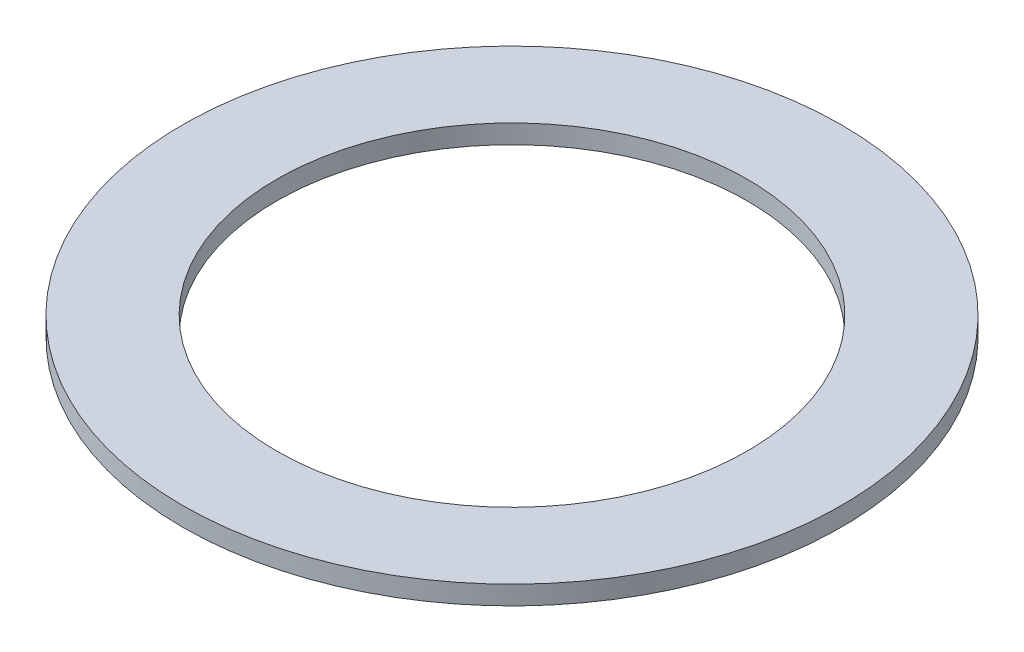
ISO-10303-21;
HEADER;
FILE_DESCRIPTION(('STEP AP214'),'2;1');
FILE_NAME('part.step','',(''),(''),'','','');
FILE_SCHEMA(('AUTOMOTIVE_DESIGN { 1 0 10303 214 1 1 1 1 }'));
ENDSEC;
DATA;
#1=APPLICATION_CONTEXT('core data for automotive mechanical design processes');
#2=APPLICATION_PROTOCOL_DEFINITION('international standard','automotive_design',2000,#1);
#3=PRODUCT_CONTEXT('',#1,'mechanical');
#4=PRODUCT('Part','Part','',(#3));
#5=PRODUCT_RELATED_PRODUCT_CATEGORY('part','',(#4));
#6=PRODUCT_DEFINITION_FORMATION('','',#4);
#7=PRODUCT_DEFINITION_CONTEXT('part definition',#1,'design');
#8=PRODUCT_DEFINITION('design','',#6,#7);
#9=PRODUCT_DEFINITION_SHAPE('','',#8);
#10=(LENGTH_UNIT() NAMED_UNIT(*) SI_UNIT(.MILLI.,.METRE.));
#11=(NAMED_UNIT(*) PLANE_ANGLE_UNIT() SI_UNIT($,.RADIAN.));
#12=(NAMED_UNIT(*) SI_UNIT($,.STERADIAN.) SOLID_ANGLE_UNIT());
#13=UNCERTAINTY_MEASURE_WITH_UNIT(LENGTH_MEASURE(1.E-05),#10,'distance_accuracy_value','');
#14=(GEOMETRIC_REPRESENTATION_CONTEXT(3) GLOBAL_UNCERTAINTY_ASSIGNED_CONTEXT((#13)) GLOBAL_UNIT_ASSIGNED_CONTEXT((#10,
#11,#12)) REPRESENTATION_CONTEXT('',''));
#15=CARTESIAN_POINT('',(0.,0.,0.));
#16=DIRECTION('',(0.,0.,1.));
#17=DIRECTION('',(1.,0.,0.));
#18=AXIS2_PLACEMENT_3D('',#15,#16,#17);
#19=CARTESIAN_POINT('',(0.,0.199999999999978,0.));
#20=DIRECTION('',(0.,-1.,0.));
#21=DIRECTION('',(0.,0.,-1.));
#22=AXIS2_PLACEMENT_3D('',#19,#20,#21);
#23=CYLINDRICAL_SURFACE('',#22,3.5);
#24=CARTESIAN_POINT('',(0.,0.199999999999978,0.));
#25=DIRECTION('',(0.,1.,0.));
#26=DIRECTION('',(0.,0.,1.));
#27=AXIS2_PLACEMENT_3D('',#24,#25,#26);
#28=CIRCLE('',#27,3.5);
#29=CARTESIAN_POINT('',(0.,0.199999999999978,3.50000000000001));
#30=VERTEX_POINT('',#29);
#31=EDGE_CURVE('E10',#30,#30,#28,.T.);
#32=ORIENTED_EDGE('',*,*,#31,.F.);
#33=EDGE_LOOP('',(#32));
#34=FACE_BOUND('',#33,.T.);
#35=CARTESIAN_POINT('',(0.,0.,0.));
#36=DIRECTION('',(0.,1.,0.));
#37=DIRECTION('',(0.,0.,1.));
#38=AXIS2_PLACEMENT_3D('',#35,#36,#37);
#39=CIRCLE('',#38,3.5);
#40=CARTESIAN_POINT('',(0.,0.,3.50000000000001));
#41=VERTEX_POINT('',#40);
#42=EDGE_CURVE('E40',#41,#41,#39,.T.);
#43=ORIENTED_EDGE('',*,*,#42,.T.);
#44=EDGE_LOOP('',(#43));
#45=FACE_BOUND('',#44,.T.);
#46=ADVANCED_FACE('F37',(#34,#45),#23,.T.);
#47=CARTESIAN_POINT('',(0.,0.199999999999978,0.));
#48=DIRECTION('',(0.,1.,0.));
#49=DIRECTION('',(0.,0.,1.));
#50=AXIS2_PLACEMENT_3D('',#47,#48,#49);
#51=PLANE('',#50);
#52=CARTESIAN_POINT('',(0.,0.199999999999978,0.));
#53=DIRECTION('',(0.,1.,0.));
#54=DIRECTION('',(0.,0.,1.));
#55=AXIS2_PLACEMENT_3D('',#52,#53,#54);
#56=CIRCLE('',#55,2.5);
#57=CARTESIAN_POINT('',(0.,0.199999999999978,2.50000000000001));
#58=VERTEX_POINT('',#57);
#59=EDGE_CURVE('E49',#58,#58,#56,.T.);
#60=ORIENTED_EDGE('',*,*,#59,.F.);
#61=EDGE_LOOP('',(#60));
#62=FACE_BOUND('',#61,.T.);
#63=ORIENTED_EDGE('',*,*,#31,.T.);
#64=EDGE_LOOP('',(#63));
#65=FACE_BOUND('',#64,.T.);
#66=ADVANCED_FACE('F64',(#62,#65),#51,.T.);
#67=CARTESIAN_POINT('',(0.,0.,0.));
#68=DIRECTION('',(0.,1.,0.));
#69=DIRECTION('',(0.,0.,1.));
#70=AXIS2_PLACEMENT_3D('',#67,#68,#69);
#71=PLANE('',#70);
#72=CARTESIAN_POINT('',(0.,0.,0.));
#73=DIRECTION('',(0.,1.,0.));
#74=DIRECTION('',(0.,0.,1.));
#75=AXIS2_PLACEMENT_3D('',#72,#73,#74);
#76=CIRCLE('',#75,2.5);
#77=CARTESIAN_POINT('',(0.,0.,2.50000000000001));
#78=VERTEX_POINT('',#77);
#79=EDGE_CURVE('E47',#78,#78,#76,.T.);
#80=ORIENTED_EDGE('',*,*,#79,.T.);
#81=EDGE_LOOP('',(#80));
#82=FACE_BOUND('',#81,.T.);
#83=ORIENTED_EDGE('',*,*,#42,.F.);
#84=EDGE_LOOP('',(#83));
#85=FACE_BOUND('',#84,.T.);
#86=ADVANCED_FACE('F55',(#82,#85),#71,.F.);
#87=CARTESIAN_POINT('',(0.,0.,0.));
#88=DIRECTION('',(0.,1.,0.));
#89=DIRECTION('',(0.,0.,1.));
#90=AXIS2_PLACEMENT_3D('',#87,#88,#89);
#91=CYLINDRICAL_SURFACE('',#90,2.5);
#92=ORIENTED_EDGE('',*,*,#79,.F.);
#93=EDGE_LOOP('',(#92));
#94=FACE_BOUND('',#93,.T.);
#95=ORIENTED_EDGE('',*,*,#59,.T.);
#96=EDGE_LOOP('',(#95));
#97=FACE_BOUND('',#96,.T.);
#98=ADVANCED_FACE('F58',(#94,#97),#91,.F.);
#99=CLOSED_SHELL('',(#46,#66,#86,#98));
#100=MANIFOLD_SOLID_BREP('B2',#99);
#101=ADVANCED_BREP_SHAPE_REPRESENTATION('',(#18,#100),#14);
#102=SHAPE_DEFINITION_REPRESENTATION(#9,#101);
ENDSEC;
END-ISO-10303-21;
